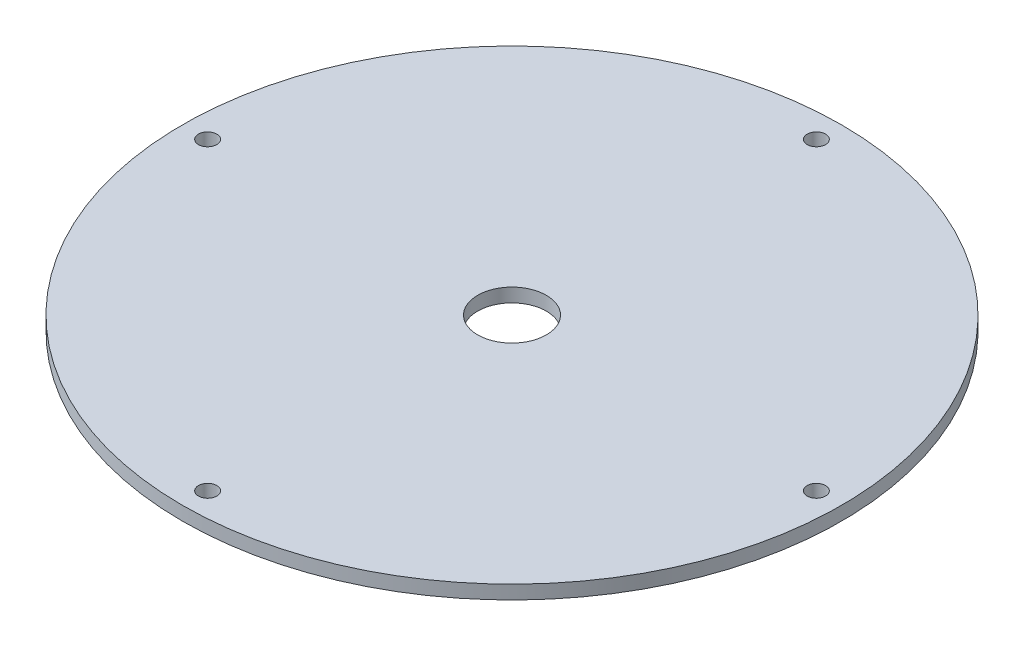
ISO-10303-21;
HEADER;
FILE_DESCRIPTION(('STEP AP214'),'2;1');
FILE_NAME('part.step','',(''),(''),'','','');
FILE_SCHEMA(('AUTOMOTIVE_DESIGN { 1 0 10303 214 1 1 1 1 }'));
ENDSEC;
DATA;
#1=APPLICATION_CONTEXT('core data for automotive mechanical design processes');
#2=APPLICATION_PROTOCOL_DEFINITION('international standard','automotive_design',2000,#1);
#3=PRODUCT_CONTEXT('',#1,'mechanical');
#4=PRODUCT('Part','Part','',(#3));
#5=PRODUCT_RELATED_PRODUCT_CATEGORY('part','',(#4));
#6=PRODUCT_DEFINITION_FORMATION('','',#4);
#7=PRODUCT_DEFINITION_CONTEXT('part definition',#1,'design');
#8=PRODUCT_DEFINITION('design','',#6,#7);
#9=PRODUCT_DEFINITION_SHAPE('','',#8);
#10=(LENGTH_UNIT() NAMED_UNIT(*) SI_UNIT(.MILLI.,.METRE.));
#11=(NAMED_UNIT(*) PLANE_ANGLE_UNIT() SI_UNIT($,.RADIAN.));
#12=(NAMED_UNIT(*) SI_UNIT($,.STERADIAN.) SOLID_ANGLE_UNIT());
#13=UNCERTAINTY_MEASURE_WITH_UNIT(LENGTH_MEASURE(1.E-05),#10,'distance_accuracy_value','');
#14=(GEOMETRIC_REPRESENTATION_CONTEXT(3) GLOBAL_UNCERTAINTY_ASSIGNED_CONTEXT((#13)) GLOBAL_UNIT_ASSIGNED_CONTEXT((#10,
#11,#12)) REPRESENTATION_CONTEXT('',''));
#15=CARTESIAN_POINT('',(0.,0.,0.));
#16=DIRECTION('',(0.,0.,1.));
#17=DIRECTION('',(1.,0.,0.));
#18=AXIS2_PLACEMENT_3D('',#15,#16,#17);
#19=CARTESIAN_POINT('',(0.,3.,0.));
#20=DIRECTION('',(0.,1.,0.));
#21=DIRECTION('',(0.,0.,1.));
#22=AXIS2_PLACEMENT_3D('',#19,#20,#21);
#23=PLANE('',#22);
#24=CARTESIAN_POINT('',(0.,3.,66.5));
#25=DIRECTION('',(0.,1.,0.));
#26=DIRECTION('',(0.,0.,1.));
#27=AXIS2_PLACEMENT_3D('',#24,#25,#26);
#28=CIRCLE('',#27,2.);
#29=CARTESIAN_POINT('',(0.,3.,68.5));
#30=VERTEX_POINT('',#29);
#31=EDGE_CURVE('E67',#30,#30,#28,.T.);
#32=ORIENTED_EDGE('',*,*,#31,.F.);
#33=EDGE_LOOP('',(#32));
#34=FACE_BOUND('',#33,.T.);
#35=CARTESIAN_POINT('',(0.,3.,-66.5));
#36=DIRECTION('',(0.,1.,0.));
#37=DIRECTION('',(0.,0.,1.));
#38=AXIS2_PLACEMENT_3D('',#35,#36,#37);
#39=CIRCLE('',#38,2.);
#40=CARTESIAN_POINT('',(0.,3.,-64.5));
#41=VERTEX_POINT('',#40);
#42=EDGE_CURVE('E55',#41,#41,#39,.T.);
#43=ORIENTED_EDGE('',*,*,#42,.F.);
#44=EDGE_LOOP('',(#43));
#45=FACE_BOUND('',#44,.T.);
#46=CARTESIAN_POINT('',(0.,3.,0.));
#47=DIRECTION('',(0.,1.,0.));
#48=DIRECTION('',(0.,0.,1.));
#49=AXIS2_PLACEMENT_3D('',#46,#47,#48);
#50=CIRCLE('',#49,72.);
#51=CARTESIAN_POINT('',(0.,3.,72.));
#52=VERTEX_POINT('',#51);
#53=EDGE_CURVE('E10',#52,#52,#50,.T.);
#54=ORIENTED_EDGE('',*,*,#53,.T.);
#55=EDGE_LOOP('',(#54));
#56=FACE_BOUND('',#55,.T.);
#57=CARTESIAN_POINT('',(0.,3.,0.));
#58=DIRECTION('',(0.,1.,0.));
#59=DIRECTION('',(0.,0.,1.));
#60=AXIS2_PLACEMENT_3D('',#57,#58,#59);
#61=CIRCLE('',#60,7.5);
#62=CARTESIAN_POINT('',(0.,3.,7.5));
#63=VERTEX_POINT('',#62);
#64=EDGE_CURVE('E50',#63,#63,#61,.T.);
#65=ORIENTED_EDGE('',*,*,#64,.F.);
#66=EDGE_LOOP('',(#65));
#67=FACE_BOUND('',#66,.T.);
#68=CARTESIAN_POINT('',(66.5,3.,0.));
#69=DIRECTION('',(0.,1.,0.));
#70=DIRECTION('',(0.,0.,1.));
#71=AXIS2_PLACEMENT_3D('',#68,#69,#70);
#72=CIRCLE('',#71,2.);
#73=CARTESIAN_POINT('',(66.5,3.,1.99999999999999));
#74=VERTEX_POINT('',#73);
#75=EDGE_CURVE('E61',#74,#74,#72,.T.);
#76=ORIENTED_EDGE('',*,*,#75,.F.);
#77=EDGE_LOOP('',(#76));
#78=FACE_BOUND('',#77,.T.);
#79=CARTESIAN_POINT('',(-66.5,3.,0.));
#80=DIRECTION('',(0.,1.,0.));
#81=DIRECTION('',(0.,0.,1.));
#82=AXIS2_PLACEMENT_3D('',#79,#80,#81);
#83=CIRCLE('',#82,2.);
#84=CARTESIAN_POINT('',(-66.5,3.,2.00000000000001));
#85=VERTEX_POINT('',#84);
#86=EDGE_CURVE('E73',#85,#85,#83,.T.);
#87=ORIENTED_EDGE('',*,*,#86,.F.);
#88=EDGE_LOOP('',(#87));
#89=FACE_BOUND('',#88,.T.);
#90=ADVANCED_FACE('F39',(#34,#45,#56,#67,#78,#89),#23,.T.);
#91=CARTESIAN_POINT('',(0.,0.,0.));
#92=DIRECTION('',(0.,1.,0.));
#93=DIRECTION('',(0.,0.,1.));
#94=AXIS2_PLACEMENT_3D('',#91,#92,#93);
#95=PLANE('',#94);
#96=CARTESIAN_POINT('',(0.,0.,0.));
#97=DIRECTION('',(0.,1.,0.));
#98=DIRECTION('',(0.,0.,1.));
#99=AXIS2_PLACEMENT_3D('',#96,#97,#98);
#100=CIRCLE('',#99,72.);
#101=CARTESIAN_POINT('',(0.,0.,72.));
#102=VERTEX_POINT('',#101);
#103=EDGE_CURVE('E43',#102,#102,#100,.T.);
#104=ORIENTED_EDGE('',*,*,#103,.F.);
#105=EDGE_LOOP('',(#104));
#106=FACE_BOUND('',#105,.T.);
#107=CARTESIAN_POINT('',(0.,0.,0.));
#108=DIRECTION('',(0.,1.,0.));
#109=DIRECTION('',(0.,0.,1.));
#110=AXIS2_PLACEMENT_3D('',#107,#108,#109);
#111=CIRCLE('',#110,7.5);
#112=CARTESIAN_POINT('',(0.,0.,7.5));
#113=VERTEX_POINT('',#112);
#114=EDGE_CURVE('E52',#113,#113,#111,.T.);
#115=ORIENTED_EDGE('',*,*,#114,.T.);
#116=EDGE_LOOP('',(#115));
#117=FACE_BOUND('',#116,.T.);
#118=CARTESIAN_POINT('',(0.,0.,-66.5));
#119=DIRECTION('',(0.,1.,0.));
#120=DIRECTION('',(0.,0.,1.));
#121=AXIS2_PLACEMENT_3D('',#118,#119,#120);
#122=CIRCLE('',#121,2.);
#123=CARTESIAN_POINT('',(0.,0.,-64.5));
#124=VERTEX_POINT('',#123);
#125=EDGE_CURVE('E58',#124,#124,#122,.T.);
#126=ORIENTED_EDGE('',*,*,#125,.T.);
#127=EDGE_LOOP('',(#126));
#128=FACE_BOUND('',#127,.T.);
#129=CARTESIAN_POINT('',(66.5,0.,0.));
#130=DIRECTION('',(0.,1.,0.));
#131=DIRECTION('',(0.,0.,1.));
#132=AXIS2_PLACEMENT_3D('',#129,#130,#131);
#133=CIRCLE('',#132,2.);
#134=CARTESIAN_POINT('',(66.5,0.,1.99999999999999));
#135=VERTEX_POINT('',#134);
#136=EDGE_CURVE('E64',#135,#135,#133,.T.);
#137=ORIENTED_EDGE('',*,*,#136,.T.);
#138=EDGE_LOOP('',(#137));
#139=FACE_BOUND('',#138,.T.);
#140=CARTESIAN_POINT('',(0.,0.,66.5));
#141=DIRECTION('',(0.,1.,0.));
#142=DIRECTION('',(0.,0.,1.));
#143=AXIS2_PLACEMENT_3D('',#140,#141,#142);
#144=CIRCLE('',#143,2.);
#145=CARTESIAN_POINT('',(0.,0.,68.5));
#146=VERTEX_POINT('',#145);
#147=EDGE_CURVE('E70',#146,#146,#144,.T.);
#148=ORIENTED_EDGE('',*,*,#147,.T.);
#149=EDGE_LOOP('',(#148));
#150=FACE_BOUND('',#149,.T.);
#151=CARTESIAN_POINT('',(-66.5,0.,0.));
#152=DIRECTION('',(0.,1.,0.));
#153=DIRECTION('',(0.,0.,1.));
#154=AXIS2_PLACEMENT_3D('',#151,#152,#153);
#155=CIRCLE('',#154,2.);
#156=CARTESIAN_POINT('',(-66.5,0.,2.00000000000001));
#157=VERTEX_POINT('',#156);
#158=EDGE_CURVE('E76',#157,#157,#155,.T.);
#159=ORIENTED_EDGE('',*,*,#158,.T.);
#160=EDGE_LOOP('',(#159));
#161=FACE_BOUND('',#160,.T.);
#162=ADVANCED_FACE('F86',(#106,#117,#128,#139,#150,#161),#95,.F.);
#163=CARTESIAN_POINT('',(0.,3.,0.));
#164=DIRECTION('',(0.,-1.,0.));
#165=DIRECTION('',(0.,0.,-1.));
#166=AXIS2_PLACEMENT_3D('',#163,#164,#165);
#167=CYLINDRICAL_SURFACE('',#166,72.);
#168=ORIENTED_EDGE('',*,*,#53,.F.);
#169=EDGE_LOOP('',(#168));
#170=FACE_BOUND('',#169,.T.);
#171=ORIENTED_EDGE('',*,*,#103,.T.);
#172=EDGE_LOOP('',(#171));
#173=FACE_BOUND('',#172,.T.);
#174=ADVANCED_FACE('F41',(#170,#173),#167,.T.);
#175=CARTESIAN_POINT('',(0.,3.,0.));
#176=DIRECTION('',(0.,-1.,0.));
#177=DIRECTION('',(0.,0.,-1.));
#178=AXIS2_PLACEMENT_3D('',#175,#176,#177);
#179=CYLINDRICAL_SURFACE('',#178,7.5);
#180=ORIENTED_EDGE('',*,*,#64,.T.);
#181=EDGE_LOOP('',(#180));
#182=FACE_BOUND('',#181,.T.);
#183=ORIENTED_EDGE('',*,*,#114,.F.);
#184=EDGE_LOOP('',(#183));
#185=FACE_BOUND('',#184,.T.);
#186=ADVANCED_FACE('F96',(#182,#185),#179,.F.);
#187=CARTESIAN_POINT('',(0.,3.,-66.5));
#188=DIRECTION('',(0.,-1.,0.));
#189=DIRECTION('',(0.,0.,-1.));
#190=AXIS2_PLACEMENT_3D('',#187,#188,#189);
#191=CYLINDRICAL_SURFACE('',#190,2.);
#192=ORIENTED_EDGE('',*,*,#42,.T.);
#193=EDGE_LOOP('',(#192));
#194=FACE_BOUND('',#193,.T.);
#195=ORIENTED_EDGE('',*,*,#125,.F.);
#196=EDGE_LOOP('',(#195));
#197=FACE_BOUND('',#196,.T.);
#198=ADVANCED_FACE('F99',(#194,#197),#191,.F.);
#199=CARTESIAN_POINT('',(66.5,3.,0.));
#200=DIRECTION('',(0.,-1.,0.));
#201=DIRECTION('',(0.,0.,-1.));
#202=AXIS2_PLACEMENT_3D('',#199,#200,#201);
#203=CYLINDRICAL_SURFACE('',#202,2.);
#204=ORIENTED_EDGE('',*,*,#75,.T.);
#205=EDGE_LOOP('',(#204));
#206=FACE_BOUND('',#205,.T.);
#207=ORIENTED_EDGE('',*,*,#136,.F.);
#208=EDGE_LOOP('',(#207));
#209=FACE_BOUND('',#208,.T.);
#210=ADVANCED_FACE('F103',(#206,#209),#203,.F.);
#211=CARTESIAN_POINT('',(0.,3.,66.5));
#212=DIRECTION('',(0.,-1.,0.));
#213=DIRECTION('',(0.,0.,-1.));
#214=AXIS2_PLACEMENT_3D('',#211,#212,#213);
#215=CYLINDRICAL_SURFACE('',#214,2.);
#216=ORIENTED_EDGE('',*,*,#31,.T.);
#217=EDGE_LOOP('',(#216));
#218=FACE_BOUND('',#217,.T.);
#219=ORIENTED_EDGE('',*,*,#147,.F.);
#220=EDGE_LOOP('',(#219));
#221=FACE_BOUND('',#220,.T.);
#222=ADVANCED_FACE('F107',(#218,#221),#215,.F.);
#223=CARTESIAN_POINT('',(-66.5,3.,0.));
#224=DIRECTION('',(0.,-1.,0.));
#225=DIRECTION('',(0.,0.,-1.));
#226=AXIS2_PLACEMENT_3D('',#223,#224,#225);
#227=CYLINDRICAL_SURFACE('',#226,2.);
#228=ORIENTED_EDGE('',*,*,#86,.T.);
#229=EDGE_LOOP('',(#228));
#230=FACE_BOUND('',#229,.T.);
#231=ORIENTED_EDGE('',*,*,#158,.F.);
#232=EDGE_LOOP('',(#231));
#233=FACE_BOUND('',#232,.T.);
#234=ADVANCED_FACE('F82',(#230,#233),#227,.F.);
#235=CLOSED_SHELL('',(#90,#162,#174,#186,#198,#210,#222,#234));
#236=MANIFOLD_SOLID_BREP('B2',#235);
#237=ADVANCED_BREP_SHAPE_REPRESENTATION('',(#18,#236),#14);
#238=SHAPE_DEFINITION_REPRESENTATION(#9,#237);
ENDSEC;
END-ISO-10303-21;
